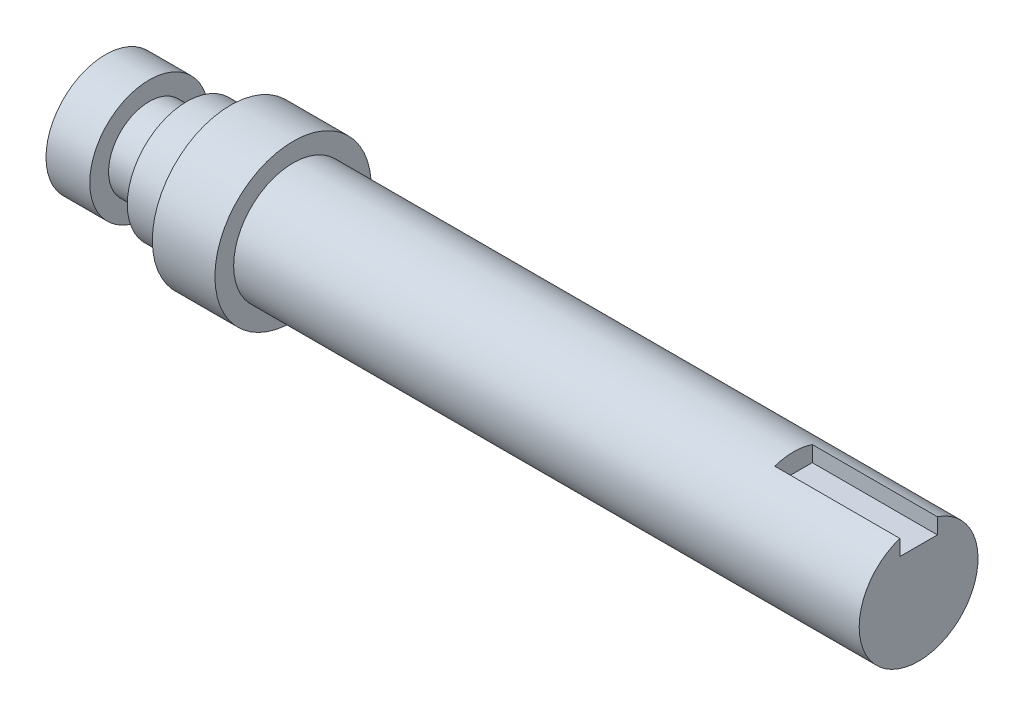
ISO-10303-21;
HEADER;
FILE_DESCRIPTION(('STEP AP214'),'2;1');
FILE_NAME('part.step','',(''),(''),'','','');
FILE_SCHEMA(('AUTOMOTIVE_DESIGN { 1 0 10303 214 1 1 1 1 }'));
ENDSEC;
DATA;
#1=APPLICATION_CONTEXT('core data for automotive mechanical design processes');
#2=APPLICATION_PROTOCOL_DEFINITION('international standard','automotive_design',2000,#1);
#3=PRODUCT_CONTEXT('',#1,'mechanical');
#4=PRODUCT('Part','Part','',(#3));
#5=PRODUCT_RELATED_PRODUCT_CATEGORY('part','',(#4));
#6=PRODUCT_DEFINITION_FORMATION('','',#4);
#7=PRODUCT_DEFINITION_CONTEXT('part definition',#1,'design');
#8=PRODUCT_DEFINITION('design','',#6,#7);
#9=PRODUCT_DEFINITION_SHAPE('','',#8);
#10=(LENGTH_UNIT() NAMED_UNIT(*) SI_UNIT(.MILLI.,.METRE.));
#11=(NAMED_UNIT(*) PLANE_ANGLE_UNIT() SI_UNIT($,.RADIAN.));
#12=(NAMED_UNIT(*) SI_UNIT($,.STERADIAN.) SOLID_ANGLE_UNIT());
#13=UNCERTAINTY_MEASURE_WITH_UNIT(LENGTH_MEASURE(1.E-05),#10,'distance_accuracy_value','');
#14=(GEOMETRIC_REPRESENTATION_CONTEXT(3) GLOBAL_UNCERTAINTY_ASSIGNED_CONTEXT((#13)) GLOBAL_UNIT_ASSIGNED_CONTEXT((#10,
#11,#12)) REPRESENTATION_CONTEXT('',''));
#15=CARTESIAN_POINT('',(0.,0.,0.));
#16=DIRECTION('',(0.,0.,1.));
#17=DIRECTION('',(1.,0.,0.));
#18=AXIS2_PLACEMENT_3D('',#15,#16,#17);
#19=CARTESIAN_POINT('',(0.,0.,0.));
#20=DIRECTION('',(-1.,0.,0.));
#21=DIRECTION('',(0.,0.,1.));
#22=AXIS2_PLACEMENT_3D('',#19,#20,#21);
#23=PLANE('',#22);
#24=DIRECTION('',(0.,1.,0.));
#25=VECTOR('',#24,1.);
#26=CARTESIAN_POINT('',(0.,6.49999999999999,-3.));
#27=LINE('',#26,#25);
#28=CARTESIAN_POINT('',(0.,6.49999999999999,-3.));
#29=VERTEX_POINT('',#28);
#30=CARTESIAN_POINT('',(0.,9.01387818865997,-3.));
#31=VERTEX_POINT('',#30);
#32=EDGE_CURVE('E95',#29,#31,#27,.T.);
#33=ORIENTED_EDGE('',*,*,#32,.F.);
#34=DIRECTION('',(0.,0.,1.));
#35=VECTOR('',#34,1.);
#36=CARTESIAN_POINT('',(0.,6.49999999999999,-3.));
#37=LINE('',#36,#35);
#38=CARTESIAN_POINT('',(0.,6.49999999999999,3.));
#39=VERTEX_POINT('',#38);
#40=EDGE_CURVE('E103',#29,#39,#37,.T.);
#41=ORIENTED_EDGE('',*,*,#40,.T.);
#42=DIRECTION('',(0.,1.,0.));
#43=VECTOR('',#42,1.);
#44=CARTESIAN_POINT('',(0.,6.49999999999999,3.));
#45=LINE('',#44,#43);
#46=CARTESIAN_POINT('',(0.,9.01387818865997,3.));
#47=VERTEX_POINT('',#46);
#48=EDGE_CURVE('E111',#39,#47,#45,.T.);
#49=ORIENTED_EDGE('',*,*,#48,.T.);
#50=CARTESIAN_POINT('',(0.,0.,0.));
#51=DIRECTION('',(-1.,0.,0.));
#52=DIRECTION('',(0.,0.,1.));
#53=AXIS2_PLACEMENT_3D('',#50,#51,#52);
#54=CIRCLE('',#53,9.50000000000001);
#55=EDGE_CURVE('E158',#31,#47,#54,.T.);
#56=ORIENTED_EDGE('',*,*,#55,.F.);
#57=EDGE_LOOP('',(#33,#41,#49,#56));
#58=FACE_BOUND('',#57,.T.);
#59=ADVANCED_FACE('F47',(#58),#23,.F.);
#60=CARTESIAN_POINT('',(0.866713413066017,0.,0.));
#61=DIRECTION('',(-1.,0.,0.));
#62=DIRECTION('',(0.,0.,1.));
#63=AXIS2_PLACEMENT_3D('',#60,#61,#62);
#64=CYLINDRICAL_SURFACE('',#63,9.49999999999999);
#65=CARTESIAN_POINT('',(-100.,0.,0.));
#66=DIRECTION('',(-1.,0.,0.));
#67=DIRECTION('',(0.,0.,1.));
#68=AXIS2_PLACEMENT_3D('',#65,#66,#67);
#69=CIRCLE('',#68,9.49999999999998);
#70=CARTESIAN_POINT('',(-100.,0.,9.49999999999998));
#71=VERTEX_POINT('',#70);
#72=EDGE_CURVE('E154',#71,#71,#69,.T.);
#73=ORIENTED_EDGE('',*,*,#72,.F.);
#74=EDGE_LOOP('',(#73));
#75=FACE_BOUND('',#74,.T.);
#76=CARTESIAN_POINT('',(-20.,0.,0.));
#77=DIRECTION('',(-1.,0.,0.));
#78=DIRECTION('',(0.,0.,1.));
#79=AXIS2_PLACEMENT_3D('',#76,#77,#78);
#80=CIRCLE('',#79,9.49999999999999);
#81=CARTESIAN_POINT('',(-20.,9.01387818865997,3.));
#82=VERTEX_POINT('',#81);
#83=CARTESIAN_POINT('',(-20.,9.01387818865997,-3.));
#84=VERTEX_POINT('',#83);
#85=EDGE_CURVE('E55',#82,#84,#80,.T.);
#86=ORIENTED_EDGE('',*,*,#85,.T.);
#87=DIRECTION('',(-1.,0.,0.));
#88=VECTOR('',#87,1.);
#89=CARTESIAN_POINT('',(0.866713413066017,9.01387818865997,-3.));
#90=LINE('',#89,#88);
#91=EDGE_CURVE('E11',#31,#84,#90,.T.);
#92=ORIENTED_EDGE('',*,*,#91,.F.);
#93=ORIENTED_EDGE('',*,*,#55,.T.);
#94=DIRECTION('',(-1.,0.,0.));
#95=VECTOR('',#94,1.);
#96=CARTESIAN_POINT('',(0.866713413066017,9.01387818865997,3.));
#97=LINE('',#96,#95);
#98=EDGE_CURVE('E162',#47,#82,#97,.T.);
#99=ORIENTED_EDGE('',*,*,#98,.T.);
#100=EDGE_LOOP('',(#86,#92,#93,#99));
#101=FACE_BOUND('',#100,.T.);
#102=ADVANCED_FACE('F165',(#75,#101),#64,.T.);
#103=CARTESIAN_POINT('',(0.866713413066017,0.,0.));
#104=DIRECTION('',(-1.,0.,0.));
#105=DIRECTION('',(0.,0.,1.));
#106=AXIS2_PLACEMENT_3D('',#103,#104,#105);
#107=CYLINDRICAL_SURFACE('',#106,9.49999999999998);
#108=CARTESIAN_POINT('',(-110.,0.,0.));
#109=DIRECTION('',(-1.,0.,0.));
#110=DIRECTION('',(0.,0.,1.));
#111=AXIS2_PLACEMENT_3D('',#108,#109,#110);
#112=CIRCLE('',#111,9.49999999999998);
#113=CARTESIAN_POINT('',(-110.,0.,9.49999999999998));
#114=VERTEX_POINT('',#113);
#115=EDGE_CURVE('E142',#114,#114,#112,.T.);
#116=ORIENTED_EDGE('',*,*,#115,.T.);
#117=EDGE_LOOP('',(#116));
#118=FACE_BOUND('',#117,.T.);
#119=CARTESIAN_POINT('',(-117.,0.,0.));
#120=DIRECTION('',(-1.,0.,0.));
#121=DIRECTION('',(0.,0.,1.));
#122=AXIS2_PLACEMENT_3D('',#119,#120,#121);
#123=CIRCLE('',#122,9.49999999999998);
#124=CARTESIAN_POINT('',(-117.,0.,9.49999999999998));
#125=VERTEX_POINT('',#124);
#126=EDGE_CURVE('E126',#125,#125,#123,.T.);
#127=ORIENTED_EDGE('',*,*,#126,.F.);
#128=EDGE_LOOP('',(#127));
#129=FACE_BOUND('',#128,.T.);
#130=ADVANCED_FACE('F175',(#118,#129),#107,.T.);
#131=CARTESIAN_POINT('',(-100.,12.5,0.));
#132=DIRECTION('',(-1.,0.,0.));
#133=DIRECTION('',(0.,0.,1.));
#134=AXIS2_PLACEMENT_3D('',#131,#132,#133);
#135=PLANE('',#134);
#136=CARTESIAN_POINT('',(-100.,0.,0.));
#137=DIRECTION('',(-1.,0.,0.));
#138=DIRECTION('',(0.,0.,1.));
#139=AXIS2_PLACEMENT_3D('',#136,#137,#138);
#140=CIRCLE('',#139,12.5);
#141=CARTESIAN_POINT('',(-100.,0.,12.5));
#142=VERTEX_POINT('',#141);
#143=EDGE_CURVE('E150',#142,#142,#140,.T.);
#144=ORIENTED_EDGE('',*,*,#143,.F.);
#145=EDGE_LOOP('',(#144));
#146=FACE_BOUND('',#145,.T.);
#147=ORIENTED_EDGE('',*,*,#72,.T.);
#148=EDGE_LOOP('',(#147));
#149=FACE_BOUND('',#148,.T.);
#150=ADVANCED_FACE('F181',(#146,#149),#135,.F.);
#151=CARTESIAN_POINT('',(0.866713413066017,0.,0.));
#152=DIRECTION('',(-1.,0.,0.));
#153=DIRECTION('',(0.,0.,1.));
#154=AXIS2_PLACEMENT_3D('',#151,#152,#153);
#155=CYLINDRICAL_SURFACE('',#154,12.5);
#156=CARTESIAN_POINT('',(-110.,0.,0.));
#157=DIRECTION('',(-1.,0.,0.));
#158=DIRECTION('',(0.,0.,1.));
#159=AXIS2_PLACEMENT_3D('',#156,#157,#158);
#160=CIRCLE('',#159,12.5);
#161=CARTESIAN_POINT('',(-110.,0.,12.5));
#162=VERTEX_POINT('',#161);
#163=EDGE_CURVE('E146',#162,#162,#160,.T.);
#164=ORIENTED_EDGE('',*,*,#163,.F.);
#165=EDGE_LOOP('',(#164));
#166=FACE_BOUND('',#165,.T.);
#167=ORIENTED_EDGE('',*,*,#143,.T.);
#168=EDGE_LOOP('',(#167));
#169=FACE_BOUND('',#168,.T.);
#170=ADVANCED_FACE('F189',(#166,#169),#155,.T.);
#171=CARTESIAN_POINT('',(-110.,9.49999999999998,0.));
#172=DIRECTION('',(1.,0.,0.));
#173=DIRECTION('',(0.,0.,-1.));
#174=AXIS2_PLACEMENT_3D('',#171,#172,#173);
#175=PLANE('',#174);
#176=ORIENTED_EDGE('',*,*,#115,.F.);
#177=EDGE_LOOP('',(#176));
#178=FACE_BOUND('',#177,.T.);
#179=ORIENTED_EDGE('',*,*,#163,.T.);
#180=EDGE_LOOP('',(#179));
#181=FACE_BOUND('',#180,.T.);
#182=ADVANCED_FACE('F193',(#178,#181),#175,.F.);
#183=CARTESIAN_POINT('',(-123.,9.49999999999998,0.));
#184=DIRECTION('',(1.,0.,0.));
#185=DIRECTION('',(0.,0.,-1.));
#186=AXIS2_PLACEMENT_3D('',#183,#184,#185);
#187=PLANE('',#186);
#188=CARTESIAN_POINT('',(-123.,0.,0.));
#189=DIRECTION('',(-1.,0.,0.));
#190=DIRECTION('',(0.,0.,1.));
#191=AXIS2_PLACEMENT_3D('',#188,#189,#190);
#192=CIRCLE('',#191,6.49999999999998);
#193=CARTESIAN_POINT('',(-123.,0.,6.49999999999998));
#194=VERTEX_POINT('',#193);
#195=EDGE_CURVE('E134',#194,#194,#192,.T.);
#196=ORIENTED_EDGE('',*,*,#195,.T.);
#197=EDGE_LOOP('',(#196));
#198=FACE_BOUND('',#197,.T.);
#199=CARTESIAN_POINT('',(-123.,0.,0.));
#200=DIRECTION('',(-1.,0.,0.));
#201=DIRECTION('',(0.,0.,1.));
#202=AXIS2_PLACEMENT_3D('',#199,#200,#201);
#203=CIRCLE('',#202,9.49999999999998);
#204=CARTESIAN_POINT('',(-123.,0.,9.49999999999998));
#205=VERTEX_POINT('',#204);
#206=EDGE_CURVE('E121',#205,#205,#203,.T.);
#207=ORIENTED_EDGE('',*,*,#206,.F.);
#208=EDGE_LOOP('',(#207));
#209=FACE_BOUND('',#208,.T.);
#210=ADVANCED_FACE('F196',(#198,#209),#187,.T.);
#211=CARTESIAN_POINT('',(-130.,0.,0.));
#212=DIRECTION('',(-1.,0.,0.));
#213=DIRECTION('',(0.,0.,1.));
#214=AXIS2_PLACEMENT_3D('',#211,#212,#213);
#215=CYLINDRICAL_SURFACE('',#214,6.49999999999998);
#216=CARTESIAN_POINT('',(-117.,0.,0.));
#217=DIRECTION('',(-1.,0.,0.));
#218=DIRECTION('',(0.,0.,1.));
#219=AXIS2_PLACEMENT_3D('',#216,#217,#218);
#220=CIRCLE('',#219,6.49999999999998);
#221=CARTESIAN_POINT('',(-117.,0.,6.49999999999998));
#222=VERTEX_POINT('',#221);
#223=EDGE_CURVE('E130',#222,#222,#220,.T.);
#224=ORIENTED_EDGE('',*,*,#223,.T.);
#225=EDGE_LOOP('',(#224));
#226=FACE_BOUND('',#225,.T.);
#227=ORIENTED_EDGE('',*,*,#195,.F.);
#228=EDGE_LOOP('',(#227));
#229=FACE_BOUND('',#228,.T.);
#230=ADVANCED_FACE('F207',(#226,#229),#215,.T.);
#231=CARTESIAN_POINT('',(-117.,9.49999999999998,0.));
#232=DIRECTION('',(-1.,0.,0.));
#233=DIRECTION('',(0.,0.,1.));
#234=AXIS2_PLACEMENT_3D('',#231,#232,#233);
#235=PLANE('',#234);
#236=ORIENTED_EDGE('',*,*,#126,.T.);
#237=EDGE_LOOP('',(#236));
#238=FACE_BOUND('',#237,.T.);
#239=ORIENTED_EDGE('',*,*,#223,.F.);
#240=EDGE_LOOP('',(#239));
#241=FACE_BOUND('',#240,.T.);
#242=ADVANCED_FACE('F203',(#238,#241),#235,.T.);
#243=CARTESIAN_POINT('',(-130.,0.,0.));
#244=DIRECTION('',(1.,0.,0.));
#245=DIRECTION('',(0.,0.,-1.));
#246=AXIS2_PLACEMENT_3D('',#243,#244,#245);
#247=PLANE('',#246);
#248=CARTESIAN_POINT('',(-130.,0.,0.));
#249=DIRECTION('',(-1.,0.,0.));
#250=DIRECTION('',(0.,0.,1.));
#251=AXIS2_PLACEMENT_3D('',#248,#249,#250);
#252=CIRCLE('',#251,9.49999999999998);
#253=CARTESIAN_POINT('',(-130.,0.,9.49999999999998));
#254=VERTEX_POINT('',#253);
#255=EDGE_CURVE('E138',#254,#254,#252,.T.);
#256=ORIENTED_EDGE('',*,*,#255,.T.);
#257=EDGE_LOOP('',(#256));
#258=FACE_BOUND('',#257,.T.);
#259=ADVANCED_FACE('F199',(#258),#247,.F.);
#260=ORIENTED_EDGE('',*,*,#255,.F.);
#261=EDGE_LOOP('',(#260));
#262=FACE_BOUND('',#261,.T.);
#263=ORIENTED_EDGE('',*,*,#206,.T.);
#264=EDGE_LOOP('',(#263));
#265=FACE_BOUND('',#264,.T.);
#266=ADVANCED_FACE('F184',(#262,#265),#107,.T.);
#267=CARTESIAN_POINT('',(-20.,6.49999999999999,-3.));
#268=DIRECTION('',(-1.,0.,0.));
#269=DIRECTION('',(0.,0.,1.));
#270=AXIS2_PLACEMENT_3D('',#267,#268,#269);
#271=PLANE('',#270);
#272=DIRECTION('',(0.,-1.,0.));
#273=VECTOR('',#272,1.);
#274=CARTESIAN_POINT('',(-20.,6.49999999999999,3.));
#275=LINE('',#274,#273);
#276=CARTESIAN_POINT('',(-20.,6.49999999999999,3.));
#277=VERTEX_POINT('',#276);
#278=EDGE_CURVE('E62',#82,#277,#275,.T.);
#279=ORIENTED_EDGE('',*,*,#278,.T.);
#280=DIRECTION('',(0.,0.,1.));
#281=VECTOR('',#280,1.);
#282=CARTESIAN_POINT('',(-20.,6.49999999999999,-3.));
#283=LINE('',#282,#281);
#284=CARTESIAN_POINT('',(-20.,6.49999999999999,-3.));
#285=VERTEX_POINT('',#284);
#286=EDGE_CURVE('E98',#285,#277,#283,.T.);
#287=ORIENTED_EDGE('',*,*,#286,.F.);
#288=DIRECTION('',(0.,-1.,0.));
#289=VECTOR('',#288,1.);
#290=CARTESIAN_POINT('',(-20.,6.49999999999999,-3.));
#291=LINE('',#290,#289);
#292=EDGE_CURVE('E87',#84,#285,#291,.T.);
#293=ORIENTED_EDGE('',*,*,#292,.F.);
#294=ORIENTED_EDGE('',*,*,#85,.F.);
#295=EDGE_LOOP('',(#279,#287,#293,#294));
#296=FACE_BOUND('',#295,.T.);
#297=ADVANCED_FACE('F99',(#296),#271,.F.);
#298=CARTESIAN_POINT('',(0.,0.,-3.));
#299=DIRECTION('',(0.,0.,1.));
#300=DIRECTION('',(1.,0.,0.));
#301=AXIS2_PLACEMENT_3D('',#298,#299,#300);
#302=PLANE('',#301);
#303=ORIENTED_EDGE('',*,*,#91,.T.);
#304=ORIENTED_EDGE('',*,*,#292,.T.);
#305=DIRECTION('',(1.,0.,0.));
#306=VECTOR('',#305,1.);
#307=CARTESIAN_POINT('',(0.,6.49999999999999,-3.));
#308=LINE('',#307,#306);
#309=EDGE_CURVE('E91',#285,#29,#308,.T.);
#310=ORIENTED_EDGE('',*,*,#309,.T.);
#311=ORIENTED_EDGE('',*,*,#32,.T.);
#312=EDGE_LOOP('',(#303,#304,#310,#311));
#313=FACE_BOUND('',#312,.T.);
#314=ADVANCED_FACE('F89',(#313),#302,.T.);
#315=CARTESIAN_POINT('',(0.,0.,3.));
#316=DIRECTION('',(0.,0.,1.));
#317=DIRECTION('',(1.,0.,0.));
#318=AXIS2_PLACEMENT_3D('',#315,#316,#317);
#319=PLANE('',#318);
#320=ORIENTED_EDGE('',*,*,#48,.F.);
#321=DIRECTION('',(1.,0.,0.));
#322=VECTOR('',#321,1.);
#323=CARTESIAN_POINT('',(0.,6.49999999999999,3.));
#324=LINE('',#323,#322);
#325=EDGE_CURVE('E117',#277,#39,#324,.T.);
#326=ORIENTED_EDGE('',*,*,#325,.F.);
#327=ORIENTED_EDGE('',*,*,#278,.F.);
#328=ORIENTED_EDGE('',*,*,#98,.F.);
#329=EDGE_LOOP('',(#320,#326,#327,#328));
#330=FACE_BOUND('',#329,.T.);
#331=ADVANCED_FACE('F167',(#330),#319,.F.);
#332=CARTESIAN_POINT('',(0.,6.49999999999999,-3.));
#333=DIRECTION('',(0.,-1.,0.));
#334=DIRECTION('',(1.,0.,0.));
#335=AXIS2_PLACEMENT_3D('',#332,#333,#334);
#336=PLANE('',#335);
#337=ORIENTED_EDGE('',*,*,#325,.T.);
#338=ORIENTED_EDGE('',*,*,#40,.F.);
#339=ORIENTED_EDGE('',*,*,#309,.F.);
#340=ORIENTED_EDGE('',*,*,#286,.T.);
#341=EDGE_LOOP('',(#337,#338,#339,#340));
#342=FACE_BOUND('',#341,.T.);
#343=ADVANCED_FACE('F105',(#342),#336,.F.);
#344=CLOSED_SHELL('',(#59,#102,#130,#150,#170,#182,#210,#230,#242,#259,#266,#297,#314,#331,#343));
#345=MANIFOLD_SOLID_BREP('B2',#344);
#346=ADVANCED_BREP_SHAPE_REPRESENTATION('',(#18,#345),#14);
#347=SHAPE_DEFINITION_REPRESENTATION(#9,#346);
ENDSEC;
END-ISO-10303-21;
